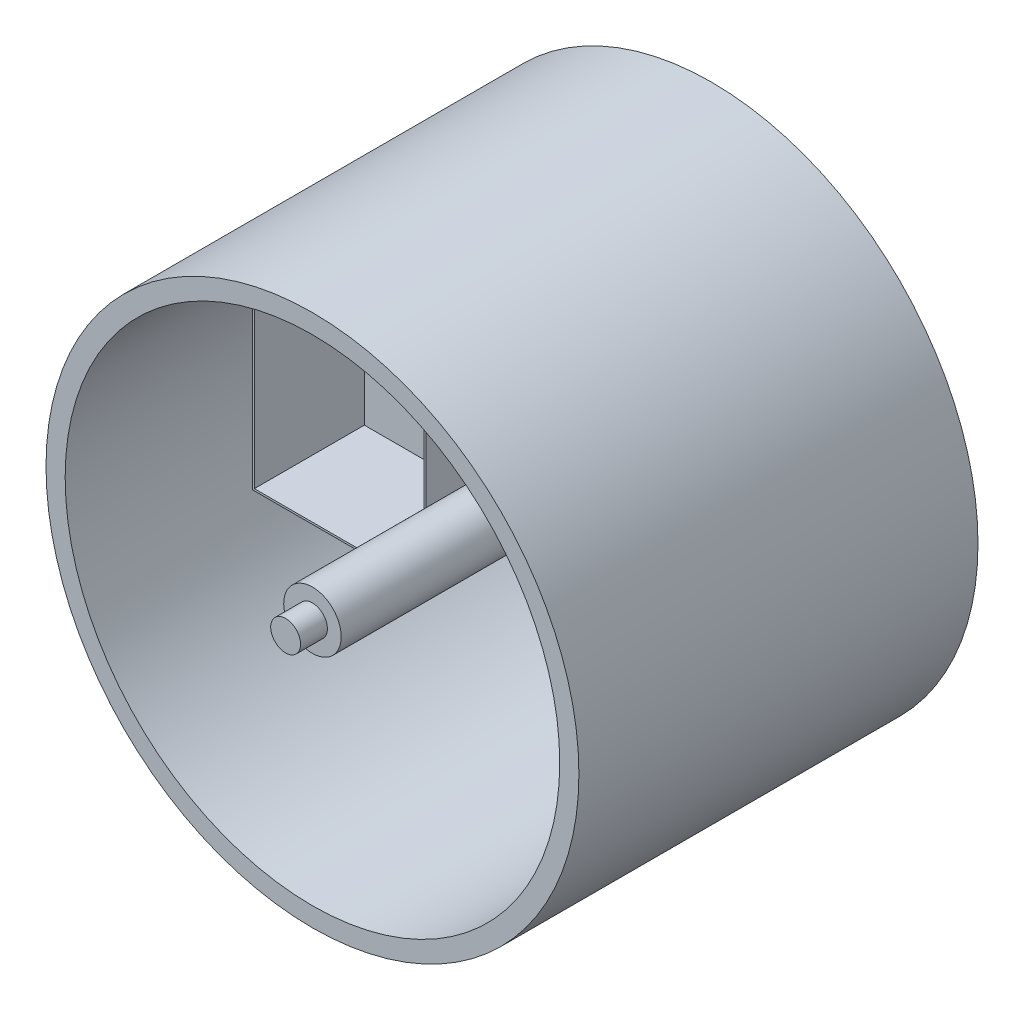
ISO-10303-21;
HEADER;
FILE_DESCRIPTION(('STEP AP214'),'2;1');
FILE_NAME('part.step','',(''),(''),'','','');
FILE_SCHEMA(('AUTOMOTIVE_DESIGN { 1 0 10303 214 1 1 1 1 }'));
ENDSEC;
DATA;
#1=APPLICATION_CONTEXT('core data for automotive mechanical design processes');
#2=APPLICATION_PROTOCOL_DEFINITION('international standard','automotive_design',2000,#1);
#3=PRODUCT_CONTEXT('',#1,'mechanical');
#4=PRODUCT('Part','Part','',(#3));
#5=PRODUCT_RELATED_PRODUCT_CATEGORY('part','',(#4));
#6=PRODUCT_DEFINITION_FORMATION('','',#4);
#7=PRODUCT_DEFINITION_CONTEXT('part definition',#1,'design');
#8=PRODUCT_DEFINITION('design','',#6,#7);
#9=PRODUCT_DEFINITION_SHAPE('','',#8);
#10=(LENGTH_UNIT() NAMED_UNIT(*) SI_UNIT(.MILLI.,.METRE.));
#11=(NAMED_UNIT(*) PLANE_ANGLE_UNIT() SI_UNIT($,.RADIAN.));
#12=(NAMED_UNIT(*) SI_UNIT($,.STERADIAN.) SOLID_ANGLE_UNIT());
#13=UNCERTAINTY_MEASURE_WITH_UNIT(LENGTH_MEASURE(1.E-05),#10,'distance_accuracy_value','');
#14=(GEOMETRIC_REPRESENTATION_CONTEXT(3) GLOBAL_UNCERTAINTY_ASSIGNED_CONTEXT((#13)) GLOBAL_UNIT_ASSIGNED_CONTEXT((#10,
#11,#12)) REPRESENTATION_CONTEXT('',''));
#15=CARTESIAN_POINT('',(0.,0.,0.));
#16=DIRECTION('',(0.,0.,1.));
#17=DIRECTION('',(1.,0.,0.));
#18=AXIS2_PLACEMENT_3D('',#15,#16,#17);
#19=CARTESIAN_POINT('',(0.,0.,59.84));
#20=DIRECTION('',(0.,0.,-1.));
#21=DIRECTION('',(-1.,0.,0.));
#22=AXIS2_PLACEMENT_3D('',#19,#20,#21);
#23=PLANE('',#22);
#24=DIRECTION('',(0.,1.,0.));
#25=VECTOR('',#24,1.);
#26=CARTESIAN_POINT('',(-14.655,-22.65,59.84));
#27=LINE('',#26,#25);
#28=CARTESIAN_POINT('',(-14.655,-22.65,59.84));
#29=VERTEX_POINT('',#28);
#30=CARTESIAN_POINT('',(-14.655,22.65,59.84));
#31=VERTEX_POINT('',#30);
#32=EDGE_CURVE('E151',#29,#31,#27,.T.);
#33=ORIENTED_EDGE('',*,*,#32,.T.);
#34=DIRECTION('',(-1.,0.,0.));
#35=VECTOR('',#34,1.);
#36=CARTESIAN_POINT('',(-59.955,22.65,59.84));
#37=LINE('',#36,#35);
#38=CARTESIAN_POINT('',(-59.955,22.65,59.84));
#39=VERTEX_POINT('',#38);
#40=EDGE_CURVE('E157',#31,#39,#37,.T.);
#41=ORIENTED_EDGE('',*,*,#40,.T.);
#42=DIRECTION('',(0.,-1.,0.));
#43=VECTOR('',#42,1.);
#44=CARTESIAN_POINT('',(-59.955,-22.65,59.84));
#45=LINE('',#44,#43);
#46=CARTESIAN_POINT('',(-59.955,-22.65,59.84));
#47=VERTEX_POINT('',#46);
#48=EDGE_CURVE('E160',#39,#47,#45,.T.);
#49=ORIENTED_EDGE('',*,*,#48,.T.);
#50=DIRECTION('',(1.,0.,0.));
#51=VECTOR('',#50,1.);
#52=CARTESIAN_POINT('',(-59.955,-22.65,59.84));
#53=LINE('',#52,#51);
#54=EDGE_CURVE('E163',#47,#29,#53,.T.);
#55=ORIENTED_EDGE('',*,*,#54,.T.);
#56=EDGE_LOOP('',(#33,#41,#49,#55));
#57=FACE_BOUND('',#56,.T.);
#58=DIRECTION('',(0.,1.,0.));
#59=VECTOR('',#58,1.);
#60=CARTESIAN_POINT('',(-59.455,0.,59.84));
#61=LINE('',#60,#59);
#62=CARTESIAN_POINT('',(-59.455,-22.15,59.84));
#63=VERTEX_POINT('',#62);
#64=CARTESIAN_POINT('',(-59.455,22.15,59.84));
#65=VERTEX_POINT('',#64);
#66=EDGE_CURVE('E143',#63,#65,#61,.T.);
#67=ORIENTED_EDGE('',*,*,#66,.T.);
#68=DIRECTION('',(1.,0.,0.));
#69=VECTOR('',#68,1.);
#70=CARTESIAN_POINT('',(0.,22.15,59.84));
#71=LINE('',#70,#69);
#72=CARTESIAN_POINT('',(-15.155,22.15,59.84));
#73=VERTEX_POINT('',#72);
#74=EDGE_CURVE('E116',#65,#73,#71,.T.);
#75=ORIENTED_EDGE('',*,*,#74,.T.);
#76=DIRECTION('',(0.,-1.,0.));
#77=VECTOR('',#76,1.);
#78=CARTESIAN_POINT('',(-15.155,0.,59.84));
#79=LINE('',#78,#77);
#80=CARTESIAN_POINT('',(-15.155,-22.15,59.84));
#81=VERTEX_POINT('',#80);
#82=EDGE_CURVE('E60',#73,#81,#79,.T.);
#83=ORIENTED_EDGE('',*,*,#82,.T.);
#84=DIRECTION('',(-1.,0.,0.));
#85=VECTOR('',#84,1.);
#86=CARTESIAN_POINT('',(0.,-22.15,59.84));
#87=LINE('',#86,#85);
#88=EDGE_CURVE('E145',#81,#63,#87,.T.);
#89=ORIENTED_EDGE('',*,*,#88,.T.);
#90=EDGE_LOOP('',(#67,#75,#83,#89));
#91=FACE_BOUND('',#90,.T.);
#92=ADVANCED_FACE('F43',(#57,#91),#23,.F.);
#93=CARTESIAN_POINT('',(0.,0.,104.14));
#94=DIRECTION('',(0.,0.,-1.));
#95=DIRECTION('',(-1.,0.,0.));
#96=AXIS2_PLACEMENT_3D('',#93,#94,#95);
#97=CYLINDRICAL_SURFACE('',#96,69.53);
#98=CARTESIAN_POINT('',(0.,0.,104.14));
#99=DIRECTION('',(0.,0.,1.));
#100=DIRECTION('',(1.,0.,0.));
#101=AXIS2_PLACEMENT_3D('',#98,#99,#100);
#102=CIRCLE('',#101,69.53);
#103=CARTESIAN_POINT('',(69.53,0.,104.14));
#104=VERTEX_POINT('',#103);
#105=EDGE_CURVE('E52',#104,#104,#102,.T.);
#106=ORIENTED_EDGE('',*,*,#105,.F.);
#107=EDGE_LOOP('',(#106));
#108=FACE_BOUND('',#107,.T.);
#109=CARTESIAN_POINT('',(0.,0.,0.));
#110=DIRECTION('',(0.,0.,1.));
#111=DIRECTION('',(1.,0.,0.));
#112=AXIS2_PLACEMENT_3D('',#109,#110,#111);
#113=CIRCLE('',#112,69.53);
#114=CARTESIAN_POINT('',(69.53,0.,0.));
#115=VERTEX_POINT('',#114);
#116=EDGE_CURVE('E47',#115,#115,#113,.T.);
#117=ORIENTED_EDGE('',*,*,#116,.T.);
#118=EDGE_LOOP('',(#117));
#119=FACE_BOUND('',#118,.T.);
#120=ADVANCED_FACE('F45',(#108,#119),#97,.T.);
#121=CARTESIAN_POINT('',(0.,0.,104.14));
#122=DIRECTION('',(0.,0.,1.));
#123=DIRECTION('',(1.,0.,0.));
#124=AXIS2_PLACEMENT_3D('',#121,#122,#123);
#125=PLANE('',#124);
#126=CARTESIAN_POINT('',(0.,0.,104.14));
#127=DIRECTION('',(0.,0.,1.));
#128=DIRECTION('',(1.,0.,0.));
#129=AXIS2_PLACEMENT_3D('',#126,#127,#128);
#130=CIRCLE('',#129,64.53);
#131=CARTESIAN_POINT('',(64.53,0.,104.14));
#132=VERTEX_POINT('',#131);
#133=EDGE_CURVE('E184',#132,#132,#130,.T.);
#134=ORIENTED_EDGE('',*,*,#133,.F.);
#135=EDGE_LOOP('',(#134));
#136=FACE_BOUND('',#135,.T.);
#137=ORIENTED_EDGE('',*,*,#105,.T.);
#138=EDGE_LOOP('',(#137));
#139=FACE_BOUND('',#138,.T.);
#140=ADVANCED_FACE('F196',(#136,#139),#125,.T.);
#141=CARTESIAN_POINT('',(0.,0.,0.));
#142=DIRECTION('',(0.,0.,1.));
#143=DIRECTION('',(1.,0.,0.));
#144=AXIS2_PLACEMENT_3D('',#141,#142,#143);
#145=PLANE('',#144);
#146=ORIENTED_EDGE('',*,*,#116,.F.);
#147=EDGE_LOOP('',(#146));
#148=FACE_BOUND('',#147,.T.);
#149=ADVANCED_FACE('F193',(#148),#145,.F.);
#150=CARTESIAN_POINT('',(0.,0.,104.14));
#151=DIRECTION('',(0.,0.,-1.));
#152=DIRECTION('',(-1.,0.,0.));
#153=AXIS2_PLACEMENT_3D('',#150,#151,#152);
#154=CYLINDRICAL_SURFACE('',#153,64.53);
#155=ORIENTED_EDGE('',*,*,#133,.T.);
#156=EDGE_LOOP('',(#155));
#157=FACE_BOUND('',#156,.T.);
#158=CARTESIAN_POINT('',(0.,0.,5.));
#159=DIRECTION('',(0.,0.,1.));
#160=DIRECTION('',(1.,0.,0.));
#161=AXIS2_PLACEMENT_3D('',#158,#159,#160);
#162=CIRCLE('',#161,64.53);
#163=CARTESIAN_POINT('',(64.53,0.,5.));
#164=VERTEX_POINT('',#163);
#165=EDGE_CURVE('E176',#164,#164,#162,.T.);
#166=ORIENTED_EDGE('',*,*,#165,.F.);
#167=EDGE_LOOP('',(#166));
#168=FACE_BOUND('',#167,.T.);
#169=ADVANCED_FACE('F195',(#157,#168),#154,.F.);
#170=CARTESIAN_POINT('',(0.,0.,5.));
#171=DIRECTION('',(0.,0.,1.));
#172=DIRECTION('',(1.,0.,0.));
#173=AXIS2_PLACEMENT_3D('',#170,#171,#172);
#174=PLANE('',#173);
#175=CARTESIAN_POINT('',(0.,0.,5.));
#176=DIRECTION('',(0.,0.,1.));
#177=DIRECTION('',(1.,0.,0.));
#178=AXIS2_PLACEMENT_3D('',#175,#176,#177);
#179=CIRCLE('',#178,7.5);
#180=CARTESIAN_POINT('',(-7.5,0.,5.));
#181=VERTEX_POINT('',#180);
#182=EDGE_CURVE('E137',#181,#181,#179,.T.);
#183=ORIENTED_EDGE('',*,*,#182,.F.);
#184=EDGE_LOOP('',(#183));
#185=FACE_BOUND('',#184,.T.);
#186=DIRECTION('',(-1.,0.,0.));
#187=VECTOR('',#186,1.);
#188=CARTESIAN_POINT('',(-59.955,-22.65,5.));
#189=LINE('',#188,#187);
#190=CARTESIAN_POINT('',(-14.655,-22.65,5.));
#191=VERTEX_POINT('',#190);
#192=CARTESIAN_POINT('',(-59.955,-22.65,5.));
#193=VERTEX_POINT('',#192);
#194=EDGE_CURVE('E68',#191,#193,#189,.T.);
#195=ORIENTED_EDGE('',*,*,#194,.T.);
#196=DIRECTION('',(0.,1.,0.));
#197=VECTOR('',#196,1.);
#198=CARTESIAN_POINT('',(-59.955,-22.65,5.));
#199=LINE('',#198,#197);
#200=CARTESIAN_POINT('',(-59.955,22.65,5.));
#201=VERTEX_POINT('',#200);
#202=EDGE_CURVE('E177',#193,#201,#199,.T.);
#203=ORIENTED_EDGE('',*,*,#202,.T.);
#204=DIRECTION('',(1.,0.,0.));
#205=VECTOR('',#204,1.);
#206=CARTESIAN_POINT('',(-59.955,22.65,5.));
#207=LINE('',#206,#205);
#208=CARTESIAN_POINT('',(-14.655,22.65,5.));
#209=VERTEX_POINT('',#208);
#210=EDGE_CURVE('E179',#201,#209,#207,.T.);
#211=ORIENTED_EDGE('',*,*,#210,.T.);
#212=DIRECTION('',(0.,-1.,0.));
#213=VECTOR('',#212,1.);
#214=CARTESIAN_POINT('',(-14.655,-22.65,5.));
#215=LINE('',#214,#213);
#216=EDGE_CURVE('E173',#209,#191,#215,.T.);
#217=ORIENTED_EDGE('',*,*,#216,.T.);
#218=EDGE_LOOP('',(#195,#203,#211,#217));
#219=FACE_BOUND('',#218,.T.);
#220=ORIENTED_EDGE('',*,*,#165,.T.);
#221=EDGE_LOOP('',(#220));
#222=FACE_BOUND('',#221,.T.);
#223=ADVANCED_FACE('F201',(#185,#219,#222),#174,.T.);
#224=CARTESIAN_POINT('',(-59.955,-22.65,-0.00199999999999853));
#225=DIRECTION('',(0.,-1.,0.));
#226=DIRECTION('',(0.,0.,-1.));
#227=AXIS2_PLACEMENT_3D('',#224,#225,#226);
#228=PLANE('',#227);
#229=ORIENTED_EDGE('',*,*,#194,.F.);
#230=DIRECTION('',(0.,0.,1.));
#231=VECTOR('',#230,1.);
#232=CARTESIAN_POINT('',(-14.655,-22.65,-0.00199999999999853));
#233=LINE('',#232,#231);
#234=EDGE_CURVE('E166',#191,#29,#233,.T.);
#235=ORIENTED_EDGE('',*,*,#234,.T.);
#236=ORIENTED_EDGE('',*,*,#54,.F.);
#237=DIRECTION('',(0.,0.,1.));
#238=VECTOR('',#237,1.);
#239=CARTESIAN_POINT('',(-59.955,-22.65,-0.00199999999999853));
#240=LINE('',#239,#238);
#241=EDGE_CURVE('E168',#193,#47,#240,.T.);
#242=ORIENTED_EDGE('',*,*,#241,.F.);
#243=EDGE_LOOP('',(#229,#235,#236,#242));
#244=FACE_BOUND('',#243,.T.);
#245=ADVANCED_FACE('F217',(#244),#228,.T.);
#246=CARTESIAN_POINT('',(-59.955,-22.65,-0.00199999999999853));
#247=DIRECTION('',(-1.,0.,0.));
#248=DIRECTION('',(0.,0.,1.));
#249=AXIS2_PLACEMENT_3D('',#246,#247,#248);
#250=PLANE('',#249);
#251=ORIENTED_EDGE('',*,*,#202,.F.);
#252=ORIENTED_EDGE('',*,*,#241,.T.);
#253=ORIENTED_EDGE('',*,*,#48,.F.);
#254=DIRECTION('',(0.,0.,1.));
#255=VECTOR('',#254,1.);
#256=CARTESIAN_POINT('',(-59.955,22.65,-0.00199999999999853));
#257=LINE('',#256,#255);
#258=EDGE_CURVE('E170',#201,#39,#257,.T.);
#259=ORIENTED_EDGE('',*,*,#258,.F.);
#260=EDGE_LOOP('',(#251,#252,#253,#259));
#261=FACE_BOUND('',#260,.T.);
#262=ADVANCED_FACE('F220',(#261),#250,.T.);
#263=CARTESIAN_POINT('',(-59.955,22.65,-0.00199999999999853));
#264=DIRECTION('',(0.,1.,0.));
#265=DIRECTION('',(0.,0.,1.));
#266=AXIS2_PLACEMENT_3D('',#263,#264,#265);
#267=PLANE('',#266);
#268=ORIENTED_EDGE('',*,*,#210,.F.);
#269=ORIENTED_EDGE('',*,*,#258,.T.);
#270=ORIENTED_EDGE('',*,*,#40,.F.);
#271=DIRECTION('',(0.,0.,1.));
#272=VECTOR('',#271,1.);
#273=CARTESIAN_POINT('',(-14.655,22.65,-0.00199999999999853));
#274=LINE('',#273,#272);
#275=EDGE_CURVE('E171',#209,#31,#274,.T.);
#276=ORIENTED_EDGE('',*,*,#275,.F.);
#277=EDGE_LOOP('',(#268,#269,#270,#276));
#278=FACE_BOUND('',#277,.T.);
#279=ADVANCED_FACE('F224',(#278),#267,.T.);
#280=CARTESIAN_POINT('',(-14.655,-22.65,-0.00199999999999853));
#281=DIRECTION('',(1.,0.,0.));
#282=DIRECTION('',(0.,0.,-1.));
#283=AXIS2_PLACEMENT_3D('',#280,#281,#282);
#284=PLANE('',#283);
#285=ORIENTED_EDGE('',*,*,#216,.F.);
#286=ORIENTED_EDGE('',*,*,#275,.T.);
#287=ORIENTED_EDGE('',*,*,#32,.F.);
#288=ORIENTED_EDGE('',*,*,#234,.F.);
#289=EDGE_LOOP('',(#285,#286,#287,#288));
#290=FACE_BOUND('',#289,.T.);
#291=ADVANCED_FACE('F228',(#290),#284,.T.);
#292=CARTESIAN_POINT('',(-59.455,0.,-31.5096608131281));
#293=DIRECTION('',(1.,0.,0.));
#294=DIRECTION('',(0.,0.,-1.));
#295=AXIS2_PLACEMENT_3D('',#292,#293,#294);
#296=PLANE('',#295);
#297=DIRECTION('',(0.,1.,0.));
#298=VECTOR('',#297,1.);
#299=CARTESIAN_POINT('',(-59.455,0.,31.14));
#300=LINE('',#299,#298);
#301=CARTESIAN_POINT('',(-59.455,-22.15,31.14));
#302=VERTEX_POINT('',#301);
#303=CARTESIAN_POINT('',(-59.455,22.15,31.14));
#304=VERTEX_POINT('',#303);
#305=EDGE_CURVE('E126',#302,#304,#300,.T.);
#306=ORIENTED_EDGE('',*,*,#305,.T.);
#307=DIRECTION('',(0.,0.,1.));
#308=VECTOR('',#307,1.);
#309=CARTESIAN_POINT('',(-59.455,22.15,-31.5096608131281));
#310=LINE('',#309,#308);
#311=EDGE_CURVE('E111',#304,#65,#310,.T.);
#312=ORIENTED_EDGE('',*,*,#311,.T.);
#313=ORIENTED_EDGE('',*,*,#66,.F.);
#314=DIRECTION('',(0.,0.,1.));
#315=VECTOR('',#314,1.);
#316=CARTESIAN_POINT('',(-59.455,-22.15,-31.5096608131281));
#317=LINE('',#316,#315);
#318=EDGE_CURVE('E121',#302,#63,#317,.T.);
#319=ORIENTED_EDGE('',*,*,#318,.F.);
#320=EDGE_LOOP('',(#306,#312,#313,#319));
#321=FACE_BOUND('',#320,.T.);
#322=ADVANCED_FACE('F131',(#321),#296,.T.);
#323=CARTESIAN_POINT('',(0.,-22.15,-31.5096608131281));
#324=DIRECTION('',(0.,1.,0.));
#325=DIRECTION('',(-1.,0.,0.));
#326=AXIS2_PLACEMENT_3D('',#323,#324,#325);
#327=PLANE('',#326);
#328=DIRECTION('',(-1.,0.,0.));
#329=VECTOR('',#328,1.);
#330=CARTESIAN_POINT('',(0.,-22.15,31.14));
#331=LINE('',#330,#329);
#332=CARTESIAN_POINT('',(-15.155,-22.15,31.14));
#333=VERTEX_POINT('',#332);
#334=EDGE_CURVE('E132',#333,#302,#331,.T.);
#335=ORIENTED_EDGE('',*,*,#334,.T.);
#336=ORIENTED_EDGE('',*,*,#318,.T.);
#337=ORIENTED_EDGE('',*,*,#88,.F.);
#338=DIRECTION('',(0.,0.,1.));
#339=VECTOR('',#338,1.);
#340=CARTESIAN_POINT('',(-15.155,-22.15,-31.5096608131281));
#341=LINE('',#340,#339);
#342=EDGE_CURVE('E152',#333,#81,#341,.T.);
#343=ORIENTED_EDGE('',*,*,#342,.F.);
#344=EDGE_LOOP('',(#335,#336,#337,#343));
#345=FACE_BOUND('',#344,.T.);
#346=ADVANCED_FACE('F273',(#345),#327,.T.);
#347=CARTESIAN_POINT('',(-15.155,0.,-31.5096608131281));
#348=DIRECTION('',(-1.,0.,0.));
#349=DIRECTION('',(0.,-1.,0.));
#350=AXIS2_PLACEMENT_3D('',#347,#348,#349);
#351=PLANE('',#350);
#352=DIRECTION('',(0.,-1.,0.));
#353=VECTOR('',#352,1.);
#354=CARTESIAN_POINT('',(-15.155,0.,31.14));
#355=LINE('',#354,#353);
#356=CARTESIAN_POINT('',(-15.155,22.15,31.14));
#357=VERTEX_POINT('',#356);
#358=EDGE_CURVE('E129',#357,#333,#355,.T.);
#359=ORIENTED_EDGE('',*,*,#358,.T.);
#360=ORIENTED_EDGE('',*,*,#342,.T.);
#361=ORIENTED_EDGE('',*,*,#82,.F.);
#362=DIRECTION('',(0.,0.,1.));
#363=VECTOR('',#362,1.);
#364=CARTESIAN_POINT('',(-15.155,22.15,-31.5096608131281));
#365=LINE('',#364,#363);
#366=EDGE_CURVE('E149',#357,#73,#365,.T.);
#367=ORIENTED_EDGE('',*,*,#366,.F.);
#368=EDGE_LOOP('',(#359,#360,#361,#367));
#369=FACE_BOUND('',#368,.T.);
#370=ADVANCED_FACE('F270',(#369),#351,.T.);
#371=CARTESIAN_POINT('',(0.,22.15,-31.5096608131281));
#372=DIRECTION('',(0.,-1.,0.));
#373=DIRECTION('',(1.,0.,0.));
#374=AXIS2_PLACEMENT_3D('',#371,#372,#373);
#375=PLANE('',#374);
#376=DIRECTION('',(1.,0.,0.));
#377=VECTOR('',#376,1.);
#378=CARTESIAN_POINT('',(0.,22.15,31.14));
#379=LINE('',#378,#377);
#380=EDGE_CURVE('E114',#304,#357,#379,.T.);
#381=ORIENTED_EDGE('',*,*,#380,.T.);
#382=ORIENTED_EDGE('',*,*,#366,.T.);
#383=ORIENTED_EDGE('',*,*,#74,.F.);
#384=ORIENTED_EDGE('',*,*,#311,.F.);
#385=EDGE_LOOP('',(#381,#382,#383,#384));
#386=FACE_BOUND('',#385,.T.);
#387=ADVANCED_FACE('F113',(#386),#375,.T.);
#388=CARTESIAN_POINT('',(0.,0.,31.14));
#389=DIRECTION('',(0.,0.,-1.));
#390=DIRECTION('',(-1.,0.,0.));
#391=AXIS2_PLACEMENT_3D('',#388,#389,#390);
#392=PLANE('',#391);
#393=ORIENTED_EDGE('',*,*,#305,.F.);
#394=ORIENTED_EDGE('',*,*,#334,.F.);
#395=ORIENTED_EDGE('',*,*,#358,.F.);
#396=ORIENTED_EDGE('',*,*,#380,.F.);
#397=EDGE_LOOP('',(#393,#394,#395,#396));
#398=FACE_BOUND('',#397,.T.);
#399=ADVANCED_FACE('F125',(#398),#392,.F.);
#400=CARTESIAN_POINT('',(0.,0.,104.14));
#401=DIRECTION('',(0.,0.,-1.));
#402=DIRECTION('',(-1.,0.,0.));
#403=AXIS2_PLACEMENT_3D('',#400,#401,#402);
#404=CYLINDRICAL_SURFACE('',#403,7.5);
#405=CARTESIAN_POINT('',(0.,0.,104.14));
#406=DIRECTION('',(0.,0.,1.));
#407=DIRECTION('',(1.,0.,0.));
#408=AXIS2_PLACEMENT_3D('',#405,#406,#407);
#409=CIRCLE('',#408,7.5);
#410=CARTESIAN_POINT('',(-7.5,0.,104.14));
#411=VERTEX_POINT('',#410);
#412=EDGE_CURVE('E133',#411,#411,#409,.T.);
#413=CARTESIAN_POINT('',(-7.5,0.,104.14));
#414=CARTESIAN_POINT('',(-7.5,0.,103.107291666667));
#415=CARTESIAN_POINT('',(-7.5,0.,102.074583333333));
#416=CARTESIAN_POINT('',(-7.5,0.,100.009166666667));
#417=CARTESIAN_POINT('',(-7.5,0.,98.9764583333333));
#418=CARTESIAN_POINT('',(-7.5,0.,96.9110416666667));
#419=CARTESIAN_POINT('',(-7.5,0.,95.8783333333333));
#420=CARTESIAN_POINT('',(-7.5,0.,93.8129166666667));
#421=CARTESIAN_POINT('',(-7.5,0.,92.7802083333333));
#422=CARTESIAN_POINT('',(-7.5,0.,90.7147916666667));
#423=CARTESIAN_POINT('',(-7.5,0.,89.6820833333333));
#424=CARTESIAN_POINT('',(-7.5,0.,87.6166666666667));
#425=CARTESIAN_POINT('',(-7.5,0.,86.5839583333333));
#426=CARTESIAN_POINT('',(-7.5,0.,84.5185416666666));
#427=CARTESIAN_POINT('',(-7.5,0.,83.4858333333333));
#428=CARTESIAN_POINT('',(-7.5,0.,81.4204166666667));
#429=CARTESIAN_POINT('',(-7.5,0.,80.3877083333333));
#430=CARTESIAN_POINT('',(-7.5,0.,78.3222916666667));
#431=CARTESIAN_POINT('',(-7.5,0.,77.2895833333333));
#432=CARTESIAN_POINT('',(-7.5,0.,75.2241666666667));
#433=CARTESIAN_POINT('',(-7.5,0.,74.1914583333333));
#434=CARTESIAN_POINT('',(-7.5,0.,72.1260416666667));
#435=CARTESIAN_POINT('',(-7.5,0.,71.0933333333333));
#436=CARTESIAN_POINT('',(-7.5,0.,69.0279166666667));
#437=CARTESIAN_POINT('',(-7.5,0.,67.9952083333333));
#438=CARTESIAN_POINT('',(-7.5,0.,65.9297916666667));
#439=CARTESIAN_POINT('',(-7.5,0.,64.8970833333333));
#440=CARTESIAN_POINT('',(-7.5,0.,62.8316666666667));
#441=CARTESIAN_POINT('',(-7.5,0.,61.7989583333333));
#442=CARTESIAN_POINT('',(-7.5,0.,59.7335416666667));
#443=CARTESIAN_POINT('',(-7.5,0.,58.7008333333333));
#444=CARTESIAN_POINT('',(-7.5,0.,56.6354166666667));
#445=CARTESIAN_POINT('',(-7.5,0.,55.6027083333333));
#446=CARTESIAN_POINT('',(-7.5,0.,53.5372916666667));
#447=CARTESIAN_POINT('',(-7.5,0.,52.5045833333333));
#448=CARTESIAN_POINT('',(-7.5,0.,50.4391666666667));
#449=CARTESIAN_POINT('',(-7.5,0.,49.4064583333333));
#450=CARTESIAN_POINT('',(-7.5,0.,47.3410416666667));
#451=CARTESIAN_POINT('',(-7.5,0.,46.3083333333333));
#452=CARTESIAN_POINT('',(-7.5,0.,44.2429166666667));
#453=CARTESIAN_POINT('',(-7.5,0.,43.2102083333333));
#454=CARTESIAN_POINT('',(-7.5,0.,41.1447916666667));
#455=CARTESIAN_POINT('',(-7.5,0.,40.1120833333333));
#456=CARTESIAN_POINT('',(-7.5,0.,38.0466666666667));
#457=CARTESIAN_POINT('',(-7.5,0.,37.0139583333333));
#458=CARTESIAN_POINT('',(-7.5,0.,34.9485416666667));
#459=CARTESIAN_POINT('',(-7.5,0.,33.9158333333333));
#460=CARTESIAN_POINT('',(-7.5,0.,31.8504166666667));
#461=CARTESIAN_POINT('',(-7.5,0.,30.8177083333333));
#462=CARTESIAN_POINT('',(-7.5,0.,28.7522916666667));
#463=CARTESIAN_POINT('',(-7.5,0.,27.7195833333333));
#464=CARTESIAN_POINT('',(-7.5,0.,25.6541666666667));
#465=CARTESIAN_POINT('',(-7.5,0.,24.6214583333333));
#466=CARTESIAN_POINT('',(-7.5,0.,22.5560416666667));
#467=CARTESIAN_POINT('',(-7.5,0.,21.5233333333333));
#468=CARTESIAN_POINT('',(-7.5,0.,19.4579166666667));
#469=CARTESIAN_POINT('',(-7.5,0.,18.4252083333333));
#470=CARTESIAN_POINT('',(-7.5,0.,16.3597916666667));
#471=CARTESIAN_POINT('',(-7.5,0.,15.3270833333333));
#472=CARTESIAN_POINT('',(-7.5,0.,13.2616666666667));
#473=CARTESIAN_POINT('',(-7.5,0.,12.2289583333333));
#474=CARTESIAN_POINT('',(-7.5,0.,10.1635416666667));
#475=CARTESIAN_POINT('',(-7.5,0.,9.13083333333334));
#476=CARTESIAN_POINT('',(-7.5,0.,7.06541666666668));
#477=CARTESIAN_POINT('',(-7.5,0.,6.03270833333334));
#478=CARTESIAN_POINT('',(-7.5,0.,5.));
#479=B_SPLINE_CURVE_WITH_KNOTS('',3,(#413,#414,#415,#416,#417,#418,#419,#420,#421,#422,#423,
#424,#425,#426,#427,#428,#429,#430,#431,#432,#433,#434,#435,#436,#437,#438,#439,#440,#441,#442,
#443,#444,#445,#446,#447,#448,#449,#450,#451,#452,#453,#454,#455,#456,#457,#458,#459,#460,#461,
#462,#463,#464,#465,#466,#467,#468,#469,#470,#471,#472,#473,#474,#475,#476,#477,#478),
.UNSPECIFIED.,.F.,.F.,(4,2,2,2,2,2,2,2,2,2,2,2,2,2,2,2,2,2,2,2,2,2,2,2,2,2,2,2,2,2,2,2,4),(0.,
3.09812500000001,6.19625,9.29437500000001,12.3925,15.490625,18.58875,21.686875,24.785,27.883125,
30.98125,34.079375,37.1775,40.275625,43.37375,46.471875,49.57,52.668125,55.76625,58.864375,
61.9625,65.060625,68.15875,71.256875,74.355,77.453125,80.55125,83.649375,86.7475,89.845625,
92.94375,96.041875,99.14),.UNSPECIFIED.);
#480=EDGE_CURVE('BSEAM234',#411,#181,#479,.T.);
#481=ORIENTED_EDGE('',*,*,#412,.F.);
#482=ORIENTED_EDGE('',*,*,#182,.T.);
#483=ORIENTED_EDGE('',*,*,#480,.T.);
#484=ORIENTED_EDGE('',*,*,#480,.F.);
#485=EDGE_LOOP('',(#481,#483,#482,#484));
#486=FACE_BOUND('',#485,.T.);
#487=ADVANCED_FACE('F234',(#486),#404,.T.);
#488=CARTESIAN_POINT('',(0.,0.,104.14));
#489=DIRECTION('',(0.,0.,1.));
#490=DIRECTION('',(1.,0.,0.));
#491=AXIS2_PLACEMENT_3D('',#488,#489,#490);
#492=PLANE('',#491);
#493=CARTESIAN_POINT('',(0.,0.,104.14));
#494=DIRECTION('',(0.,0.,1.));
#495=DIRECTION('',(1.,0.,0.));
#496=AXIS2_PLACEMENT_3D('',#493,#494,#495);
#497=CIRCLE('',#496,3.9);
#498=CARTESIAN_POINT('',(3.9,0.,104.14));
#499=VERTEX_POINT('',#498);
#500=EDGE_CURVE('E11',#499,#499,#497,.T.);
#501=ORIENTED_EDGE('',*,*,#500,.F.);
#502=EDGE_LOOP('',(#501));
#503=FACE_BOUND('',#502,.T.);
#504=ORIENTED_EDGE('',*,*,#412,.T.);
#505=EDGE_LOOP('',(#504));
#506=FACE_BOUND('',#505,.T.);
#507=ADVANCED_FACE('F256',(#503,#506),#492,.T.);
#508=CARTESIAN_POINT('',(0.,0.,111.14));
#509=DIRECTION('',(0.,0.,-1.));
#510=DIRECTION('',(-1.,0.,0.));
#511=AXIS2_PLACEMENT_3D('',#508,#509,#510);
#512=CYLINDRICAL_SURFACE('',#511,3.9);
#513=CARTESIAN_POINT('',(0.,0.,111.14));
#514=DIRECTION('',(0.,0.,1.));
#515=DIRECTION('',(1.,0.,0.));
#516=AXIS2_PLACEMENT_3D('',#513,#514,#515);
#517=CIRCLE('',#516,3.9);
#518=CARTESIAN_POINT('',(3.9,0.,111.14));
#519=VERTEX_POINT('',#518);
#520=EDGE_CURVE('E246',#519,#519,#517,.T.);
#521=ORIENTED_EDGE('',*,*,#520,.F.);
#522=EDGE_LOOP('',(#521));
#523=FACE_BOUND('',#522,.T.);
#524=ORIENTED_EDGE('',*,*,#500,.T.);
#525=EDGE_LOOP('',(#524));
#526=FACE_BOUND('',#525,.T.);
#527=ADVANCED_FACE('F253',(#523,#526),#512,.T.);
#528=CARTESIAN_POINT('',(0.,0.,111.14));
#529=DIRECTION('',(0.,0.,1.));
#530=DIRECTION('',(1.,0.,0.));
#531=AXIS2_PLACEMENT_3D('',#528,#529,#530);
#532=PLANE('',#531);
#533=ORIENTED_EDGE('',*,*,#520,.T.);
#534=EDGE_LOOP('',(#533));
#535=FACE_BOUND('',#534,.T.);
#536=ADVANCED_FACE('F251',(#535),#532,.T.);
#537=CLOSED_SHELL('',(#92,#120,#140,#149,#169,#223,#245,#262,#279,#291,#322,#346,#370,#387,#399,
#487,#507,#527,#536));
#538=MANIFOLD_SOLID_BREP('B2',#537);
#539=ADVANCED_BREP_SHAPE_REPRESENTATION('',(#18,#538),#14);
#540=SHAPE_DEFINITION_REPRESENTATION(#9,#539);
ENDSEC;
END-ISO-10303-21;
